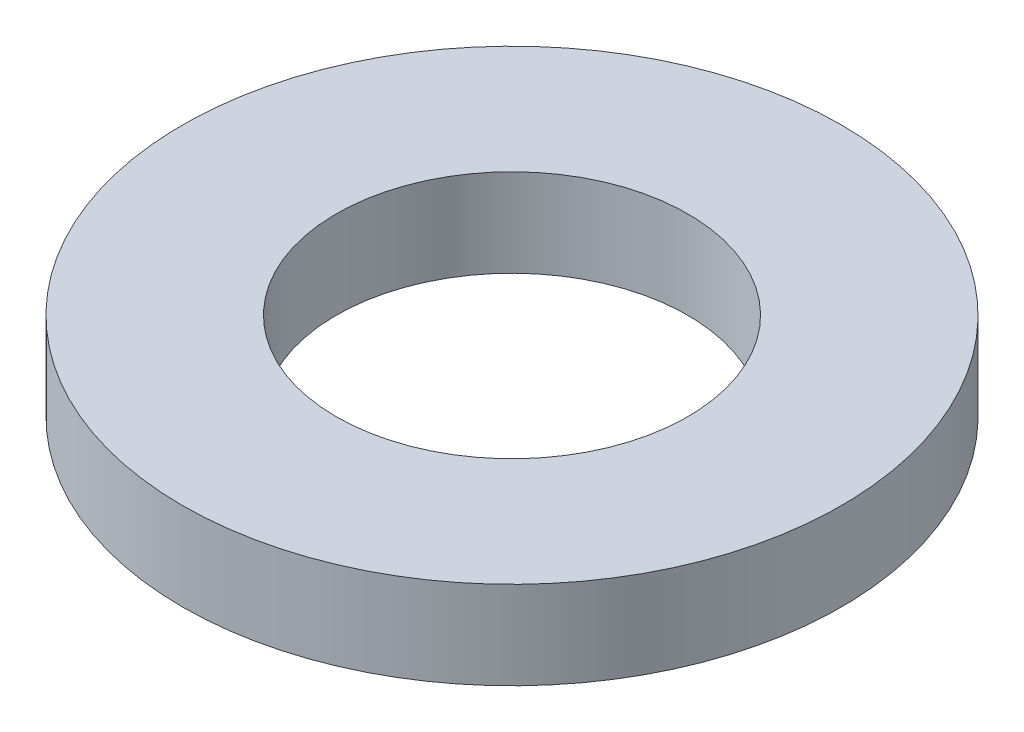
ISO-10303-21;
HEADER;
FILE_DESCRIPTION(('STEP AP214'),'2;1');
FILE_NAME('part.step','',(''),(''),'','','');
FILE_SCHEMA(('AUTOMOTIVE_DESIGN { 1 0 10303 214 1 1 1 1 }'));
ENDSEC;
DATA;
#1=APPLICATION_CONTEXT('core data for automotive mechanical design processes');
#2=APPLICATION_PROTOCOL_DEFINITION('international standard','automotive_design',2000,#1);
#3=PRODUCT_CONTEXT('',#1,'mechanical');
#4=PRODUCT('Part','Part','',(#3));
#5=PRODUCT_RELATED_PRODUCT_CATEGORY('part','',(#4));
#6=PRODUCT_DEFINITION_FORMATION('','',#4);
#7=PRODUCT_DEFINITION_CONTEXT('part definition',#1,'design');
#8=PRODUCT_DEFINITION('design','',#6,#7);
#9=PRODUCT_DEFINITION_SHAPE('','',#8);
#10=(LENGTH_UNIT() NAMED_UNIT(*) SI_UNIT(.MILLI.,.METRE.));
#11=(NAMED_UNIT(*) PLANE_ANGLE_UNIT() SI_UNIT($,.RADIAN.));
#12=(NAMED_UNIT(*) SI_UNIT($,.STERADIAN.) SOLID_ANGLE_UNIT());
#13=UNCERTAINTY_MEASURE_WITH_UNIT(LENGTH_MEASURE(1.E-05),#10,'distance_accuracy_value','');
#14=(GEOMETRIC_REPRESENTATION_CONTEXT(3) GLOBAL_UNCERTAINTY_ASSIGNED_CONTEXT((#13)) GLOBAL_UNIT_ASSIGNED_CONTEXT((#10,
#11,#12)) REPRESENTATION_CONTEXT('',''));
#15=CARTESIAN_POINT('',(0.,0.,0.));
#16=DIRECTION('',(0.,0.,1.));
#17=DIRECTION('',(1.,0.,0.));
#18=AXIS2_PLACEMENT_3D('',#15,#16,#17);
#19=CARTESIAN_POINT('',(0.,3.175,0.));
#20=DIRECTION('',(0.,1.,0.));
#21=DIRECTION('',(0.,0.,1.));
#22=AXIS2_PLACEMENT_3D('',#19,#20,#21);
#23=PLANE('',#22);
#24=CARTESIAN_POINT('',(0.,3.175,0.));
#25=DIRECTION('',(0.,1.,0.));
#26=DIRECTION('',(0.,0.,1.));
#27=AXIS2_PLACEMENT_3D('',#24,#25,#26);
#28=CIRCLE('',#27,11.90625);
#29=CARTESIAN_POINT('',(0.,3.175,11.90625));
#30=VERTEX_POINT('',#29);
#31=EDGE_CURVE('E10',#30,#30,#28,.T.);
#32=ORIENTED_EDGE('',*,*,#31,.T.);
#33=EDGE_LOOP('',(#32));
#34=FACE_BOUND('',#33,.T.);
#35=CARTESIAN_POINT('',(0.,3.175,0.));
#36=DIRECTION('',(0.,1.,0.));
#37=DIRECTION('',(0.,0.,1.));
#38=AXIS2_PLACEMENT_3D('',#35,#36,#37);
#39=CIRCLE('',#38,6.35);
#40=CARTESIAN_POINT('',(0.,3.175,6.35));
#41=VERTEX_POINT('',#40);
#42=EDGE_CURVE('E44',#41,#41,#39,.T.);
#43=ORIENTED_EDGE('',*,*,#42,.F.);
#44=EDGE_LOOP('',(#43));
#45=FACE_BOUND('',#44,.T.);
#46=ADVANCED_FACE('F33',(#34,#45),#23,.T.);
#47=CARTESIAN_POINT('',(0.,0.,0.));
#48=DIRECTION('',(0.,1.,0.));
#49=DIRECTION('',(0.,0.,1.));
#50=AXIS2_PLACEMENT_3D('',#47,#48,#49);
#51=PLANE('',#50);
#52=CARTESIAN_POINT('',(0.,0.,0.));
#53=DIRECTION('',(0.,1.,0.));
#54=DIRECTION('',(0.,0.,1.));
#55=AXIS2_PLACEMENT_3D('',#52,#53,#54);
#56=CIRCLE('',#55,11.90625);
#57=CARTESIAN_POINT('',(0.,0.,11.90625));
#58=VERTEX_POINT('',#57);
#59=EDGE_CURVE('E37',#58,#58,#56,.T.);
#60=ORIENTED_EDGE('',*,*,#59,.F.);
#61=EDGE_LOOP('',(#60));
#62=FACE_BOUND('',#61,.T.);
#63=CARTESIAN_POINT('',(0.,0.,0.));
#64=DIRECTION('',(0.,1.,0.));
#65=DIRECTION('',(0.,0.,1.));
#66=AXIS2_PLACEMENT_3D('',#63,#64,#65);
#67=CIRCLE('',#66,6.35);
#68=CARTESIAN_POINT('',(0.,0.,6.35));
#69=VERTEX_POINT('',#68);
#70=EDGE_CURVE('E46',#69,#69,#67,.T.);
#71=ORIENTED_EDGE('',*,*,#70,.T.);
#72=EDGE_LOOP('',(#71));
#73=FACE_BOUND('',#72,.T.);
#74=ADVANCED_FACE('F56',(#62,#73),#51,.F.);
#75=CARTESIAN_POINT('',(0.,3.175,0.));
#76=DIRECTION('',(0.,-1.,0.));
#77=DIRECTION('',(0.,0.,-1.));
#78=AXIS2_PLACEMENT_3D('',#75,#76,#77);
#79=CYLINDRICAL_SURFACE('',#78,11.90625);
#80=ORIENTED_EDGE('',*,*,#31,.F.);
#81=EDGE_LOOP('',(#80));
#82=FACE_BOUND('',#81,.T.);
#83=ORIENTED_EDGE('',*,*,#59,.T.);
#84=EDGE_LOOP('',(#83));
#85=FACE_BOUND('',#84,.T.);
#86=ADVANCED_FACE('F35',(#82,#85),#79,.T.);
#87=CARTESIAN_POINT('',(0.,3.175,0.));
#88=DIRECTION('',(0.,-1.,0.));
#89=DIRECTION('',(0.,0.,-1.));
#90=AXIS2_PLACEMENT_3D('',#87,#88,#89);
#91=CYLINDRICAL_SURFACE('',#90,6.35);
#92=ORIENTED_EDGE('',*,*,#42,.T.);
#93=EDGE_LOOP('',(#92));
#94=FACE_BOUND('',#93,.T.);
#95=ORIENTED_EDGE('',*,*,#70,.F.);
#96=EDGE_LOOP('',(#95));
#97=FACE_BOUND('',#96,.T.);
#98=ADVANCED_FACE('F52',(#94,#97),#91,.F.);
#99=CLOSED_SHELL('',(#46,#74,#86,#98));
#100=MANIFOLD_SOLID_BREP('B2',#99);
#101=ADVANCED_BREP_SHAPE_REPRESENTATION('',(#18,#100),#14);
#102=SHAPE_DEFINITION_REPRESENTATION(#9,#101);
ENDSEC;
END-ISO-10303-21;
